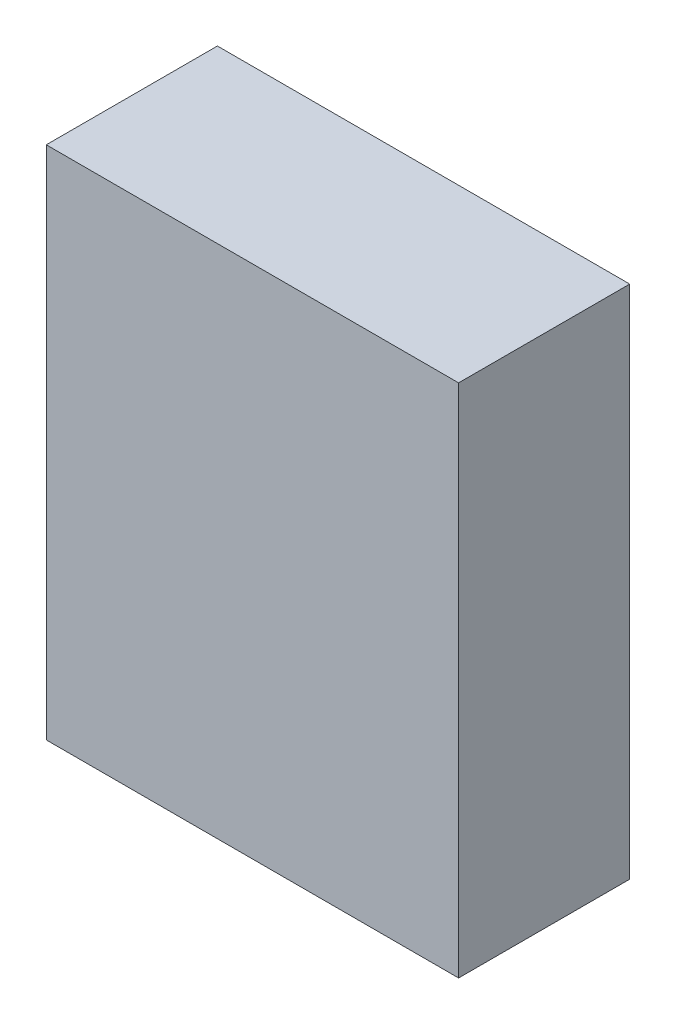
ISO-10303-21;
HEADER;
FILE_DESCRIPTION(('STEP AP214'),'2;1');
FILE_NAME('part.step','',(''),(''),'','','');
FILE_SCHEMA(('AUTOMOTIVE_DESIGN { 1 0 10303 214 1 1 1 1 }'));
ENDSEC;
DATA;
#1=APPLICATION_CONTEXT('core data for automotive mechanical design processes');
#2=APPLICATION_PROTOCOL_DEFINITION('international standard','automotive_design',2000,#1);
#3=PRODUCT_CONTEXT('',#1,'mechanical');
#4=PRODUCT('Part','Part','',(#3));
#5=PRODUCT_RELATED_PRODUCT_CATEGORY('part','',(#4));
#6=PRODUCT_DEFINITION_FORMATION('','',#4);
#7=PRODUCT_DEFINITION_CONTEXT('part definition',#1,'design');
#8=PRODUCT_DEFINITION('design','',#6,#7);
#9=PRODUCT_DEFINITION_SHAPE('','',#8);
#10=(LENGTH_UNIT() NAMED_UNIT(*) SI_UNIT(.MILLI.,.METRE.));
#11=(NAMED_UNIT(*) PLANE_ANGLE_UNIT() SI_UNIT($,.RADIAN.));
#12=(NAMED_UNIT(*) SI_UNIT($,.STERADIAN.) SOLID_ANGLE_UNIT());
#13=UNCERTAINTY_MEASURE_WITH_UNIT(LENGTH_MEASURE(1.E-05),#10,'distance_accuracy_value','');
#14=(GEOMETRIC_REPRESENTATION_CONTEXT(3) GLOBAL_UNCERTAINTY_ASSIGNED_CONTEXT((#13)) GLOBAL_UNIT_ASSIGNED_CONTEXT((#10,
#11,#12)) REPRESENTATION_CONTEXT('',''));
#15=CARTESIAN_POINT('',(0.,0.,0.));
#16=DIRECTION('',(0.,0.,1.));
#17=DIRECTION('',(1.,0.,0.));
#18=AXIS2_PLACEMENT_3D('',#15,#16,#17);
#19=CARTESIAN_POINT('',(-1.99999854,2.50000008,1.65999922));
#20=DIRECTION('',(0.,0.,-1.));
#21=DIRECTION('',(-1.,0.,0.));
#22=AXIS2_PLACEMENT_3D('',#19,#20,#21);
#23=PLANE('',#22);
#24=DIRECTION('',(1.,0.,0.));
#25=VECTOR('',#24,1.);
#26=CARTESIAN_POINT('',(-1.99999854,-2.50000008,1.65999922));
#27=LINE('',#26,#25);
#28=CARTESIAN_POINT('',(-1.99999854,-2.50000008,1.65999922));
#29=VERTEX_POINT('',#28);
#30=CARTESIAN_POINT('',(2.00000108,-2.50000008,1.65999922));
#31=VERTEX_POINT('',#30);
#32=EDGE_CURVE('E55',#29,#31,#27,.T.);
#33=ORIENTED_EDGE('',*,*,#32,.T.);
#34=DIRECTION('',(0.,1.,0.));
#35=VECTOR('',#34,1.);
#36=CARTESIAN_POINT('',(2.00000108,-2.50000008,1.65999922));
#37=LINE('',#36,#35);
#38=CARTESIAN_POINT('',(2.00000108,2.50000008,1.65999922));
#39=VERTEX_POINT('',#38);
#40=EDGE_CURVE('E57',#31,#39,#37,.T.);
#41=ORIENTED_EDGE('',*,*,#40,.T.);
#42=DIRECTION('',(1.,0.,0.));
#43=VECTOR('',#42,1.);
#44=CARTESIAN_POINT('',(2.00000108,2.50000008,1.65999922));
#45=LINE('',#44,#43);
#46=CARTESIAN_POINT('',(-1.99999854,2.50000008,1.65999922));
#47=VERTEX_POINT('',#46);
#48=EDGE_CURVE('E20',#39,#47,#45,.F.);
#49=ORIENTED_EDGE('',*,*,#48,.T.);
#50=DIRECTION('',(0.,1.,0.));
#51=VECTOR('',#50,1.);
#52=CARTESIAN_POINT('',(-1.99999854,2.50000008,1.65999922));
#53=LINE('',#52,#51);
#54=EDGE_CURVE('E80',#47,#29,#53,.F.);
#55=ORIENTED_EDGE('',*,*,#54,.T.);
#56=EDGE_LOOP('',(#33,#41,#49,#55));
#57=FACE_BOUND('',#56,.T.);
#58=ADVANCED_FACE('F17',(#57),#23,.F.);
#59=CARTESIAN_POINT('',(2.00000108,2.50000008,0.));
#60=DIRECTION('',(0.,-1.,0.));
#61=DIRECTION('',(0.,0.,-1.));
#62=AXIS2_PLACEMENT_3D('',#59,#60,#61);
#63=PLANE('',#62);
#64=DIRECTION('',(0.,0.,-1.));
#65=VECTOR('',#64,1.);
#66=CARTESIAN_POINT('',(-1.99999854,2.50000008,0.));
#67=LINE('',#66,#65);
#68=CARTESIAN_POINT('',(-1.99999854,2.50000008,0.));
#69=VERTEX_POINT('',#68);
#70=EDGE_CURVE('E68',#69,#47,#67,.F.);
#71=ORIENTED_EDGE('',*,*,#70,.T.);
#72=ORIENTED_EDGE('',*,*,#48,.F.);
#73=DIRECTION('',(0.,0.,1.));
#74=VECTOR('',#73,1.);
#75=CARTESIAN_POINT('',(2.00000108,2.50000008,0.));
#76=LINE('',#75,#74);
#77=CARTESIAN_POINT('',(2.00000108,2.50000008,0.));
#78=VERTEX_POINT('',#77);
#79=EDGE_CURVE('E63',#39,#78,#76,.F.);
#80=ORIENTED_EDGE('',*,*,#79,.T.);
#81=DIRECTION('',(-1.,0.,0.));
#82=VECTOR('',#81,1.);
#83=CARTESIAN_POINT('',(-1.99999854,2.50000008,0.));
#84=LINE('',#83,#82);
#85=EDGE_CURVE('E83',#69,#78,#84,.F.);
#86=ORIENTED_EDGE('',*,*,#85,.F.);
#87=EDGE_LOOP('',(#71,#72,#80,#86));
#88=FACE_BOUND('',#87,.T.);
#89=ADVANCED_FACE('F65',(#88),#63,.F.);
#90=CARTESIAN_POINT('',(2.00000108,-2.50000008,0.));
#91=DIRECTION('',(-1.,0.,0.));
#92=DIRECTION('',(0.,0.,1.));
#93=AXIS2_PLACEMENT_3D('',#90,#91,#92);
#94=PLANE('',#93);
#95=ORIENTED_EDGE('',*,*,#79,.F.);
#96=ORIENTED_EDGE('',*,*,#40,.F.);
#97=DIRECTION('',(0.,0.,1.));
#98=VECTOR('',#97,1.);
#99=CARTESIAN_POINT('',(2.00000108,-2.50000008,0.));
#100=LINE('',#99,#98);
#101=CARTESIAN_POINT('',(2.00000108,-2.50000008,0.));
#102=VERTEX_POINT('',#101);
#103=EDGE_CURVE('E75',#31,#102,#100,.F.);
#104=ORIENTED_EDGE('',*,*,#103,.T.);
#105=DIRECTION('',(0.,1.,0.));
#106=VECTOR('',#105,1.);
#107=CARTESIAN_POINT('',(2.00000108,2.50000008,0.));
#108=LINE('',#107,#106);
#109=EDGE_CURVE('E72',#78,#102,#108,.F.);
#110=ORIENTED_EDGE('',*,*,#109,.F.);
#111=EDGE_LOOP('',(#95,#96,#104,#110));
#112=FACE_BOUND('',#111,.T.);
#113=ADVANCED_FACE('F70',(#112),#94,.F.);
#114=CARTESIAN_POINT('',(-1.99999854,-2.50000008,0.));
#115=DIRECTION('',(0.,1.,0.));
#116=DIRECTION('',(0.,0.,1.));
#117=AXIS2_PLACEMENT_3D('',#114,#115,#116);
#118=PLANE('',#117);
#119=ORIENTED_EDGE('',*,*,#103,.F.);
#120=ORIENTED_EDGE('',*,*,#32,.F.);
#121=DIRECTION('',(0.,0.,-1.));
#122=VECTOR('',#121,1.);
#123=CARTESIAN_POINT('',(-1.99999854,-2.50000008,0.));
#124=LINE('',#123,#122);
#125=CARTESIAN_POINT('',(-1.99999854,-2.50000008,0.));
#126=VERTEX_POINT('',#125);
#127=EDGE_CURVE('E35',#29,#126,#124,.T.);
#128=ORIENTED_EDGE('',*,*,#127,.T.);
#129=DIRECTION('',(-1.,0.,0.));
#130=VECTOR('',#129,1.);
#131=CARTESIAN_POINT('',(-1.99999854,-2.50000008,0.));
#132=LINE('',#131,#130);
#133=EDGE_CURVE('E26',#102,#126,#132,.T.);
#134=ORIENTED_EDGE('',*,*,#133,.F.);
#135=EDGE_LOOP('',(#119,#120,#128,#134));
#136=FACE_BOUND('',#135,.T.);
#137=ADVANCED_FACE('F89',(#136),#118,.F.);
#138=CARTESIAN_POINT('',(-1.99999854,2.50000008,0.));
#139=DIRECTION('',(1.,0.,0.));
#140=DIRECTION('',(0.,0.,-1.));
#141=AXIS2_PLACEMENT_3D('',#138,#139,#140);
#142=PLANE('',#141);
#143=ORIENTED_EDGE('',*,*,#127,.F.);
#144=ORIENTED_EDGE('',*,*,#54,.F.);
#145=ORIENTED_EDGE('',*,*,#70,.F.);
#146=DIRECTION('',(0.,1.,0.));
#147=VECTOR('',#146,1.);
#148=CARTESIAN_POINT('',(-1.99999854,2.50000008,0.));
#149=LINE('',#148,#147);
#150=EDGE_CURVE('E11',#126,#69,#149,.T.);
#151=ORIENTED_EDGE('',*,*,#150,.F.);
#152=EDGE_LOOP('',(#143,#144,#145,#151));
#153=FACE_BOUND('',#152,.T.);
#154=ADVANCED_FACE('F91',(#153),#142,.F.);
#155=CARTESIAN_POINT('',(-1.99999854,2.50000008,0.));
#156=DIRECTION('',(0.,0.,-1.));
#157=DIRECTION('',(-1.,0.,0.));
#158=AXIS2_PLACEMENT_3D('',#155,#156,#157);
#159=PLANE('',#158);
#160=ORIENTED_EDGE('',*,*,#133,.T.);
#161=ORIENTED_EDGE('',*,*,#150,.T.);
#162=ORIENTED_EDGE('',*,*,#85,.T.);
#163=ORIENTED_EDGE('',*,*,#109,.T.);
#164=EDGE_LOOP('',(#160,#161,#162,#163));
#165=FACE_BOUND('',#164,.T.);
#166=ADVANCED_FACE('F88',(#165),#159,.T.);
#167=CLOSED_SHELL('',(#58,#89,#113,#137,#154,#166));
#168=MANIFOLD_SOLID_BREP('B1',#167);
#169=ADVANCED_BREP_SHAPE_REPRESENTATION('',(#18,#168),#14);
#170=SHAPE_DEFINITION_REPRESENTATION(#9,#169);
ENDSEC;
END-ISO-10303-21;
